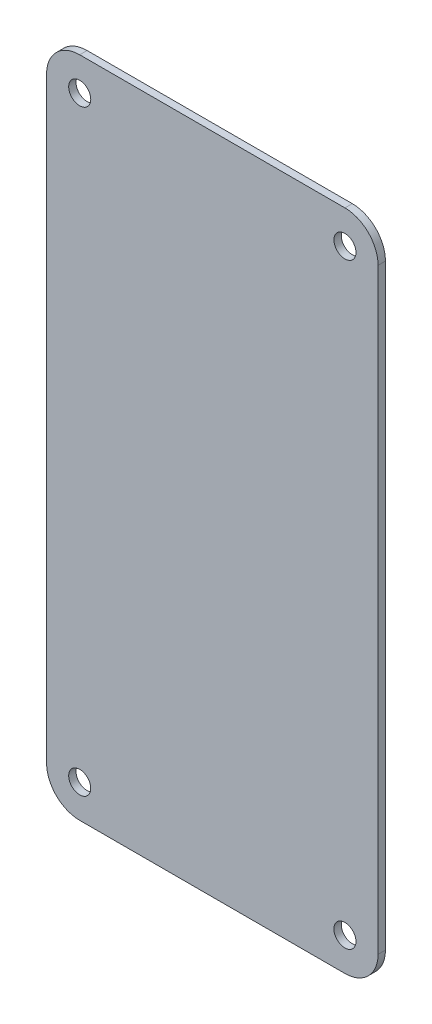
ISO-10303-21;
HEADER;
FILE_DESCRIPTION(('STEP AP214'),'2;1');
FILE_NAME('part.step','',(''),(''),'','','');
FILE_SCHEMA(('AUTOMOTIVE_DESIGN { 1 0 10303 214 1 1 1 1 }'));
ENDSEC;
DATA;
#1=APPLICATION_CONTEXT('core data for automotive mechanical design processes');
#2=APPLICATION_PROTOCOL_DEFINITION('international standard','automotive_design',2000,#1);
#3=PRODUCT_CONTEXT('',#1,'mechanical');
#4=PRODUCT('Part','Part','',(#3));
#5=PRODUCT_RELATED_PRODUCT_CATEGORY('part','',(#4));
#6=PRODUCT_DEFINITION_FORMATION('','',#4);
#7=PRODUCT_DEFINITION_CONTEXT('part definition',#1,'design');
#8=PRODUCT_DEFINITION('design','',#6,#7);
#9=PRODUCT_DEFINITION_SHAPE('','',#8);
#10=(LENGTH_UNIT() NAMED_UNIT(*) SI_UNIT(.MILLI.,.METRE.));
#11=(NAMED_UNIT(*) PLANE_ANGLE_UNIT() SI_UNIT($,.RADIAN.));
#12=(NAMED_UNIT(*) SI_UNIT($,.STERADIAN.) SOLID_ANGLE_UNIT());
#13=UNCERTAINTY_MEASURE_WITH_UNIT(LENGTH_MEASURE(1.E-05),#10,'distance_accuracy_value','');
#14=(GEOMETRIC_REPRESENTATION_CONTEXT(3) GLOBAL_UNCERTAINTY_ASSIGNED_CONTEXT((#13)) GLOBAL_UNIT_ASSIGNED_CONTEXT((#10,
#11,#12)) REPRESENTATION_CONTEXT('',''));
#15=CARTESIAN_POINT('',(0.,0.,0.));
#16=DIRECTION('',(0.,0.,1.));
#17=DIRECTION('',(1.,0.,0.));
#18=AXIS2_PLACEMENT_3D('',#15,#16,#17);
#19=CARTESIAN_POINT('',(-101.443383637,137.056539338,1.));
#20=DIRECTION('',(0.,0.,1.));
#21=DIRECTION('',(1.,0.,0.));
#22=AXIS2_PLACEMENT_3D('',#19,#20,#21);
#23=PLANE('',#22);
#24=CARTESIAN_POINT('',(-101.443383637,56.056539338,1.));
#25=DIRECTION('',(0.,0.,1.));
#26=DIRECTION('',(1.,0.,0.));
#27=AXIS2_PLACEMENT_3D('',#24,#25,#26);
#28=CIRCLE('',#27,1.5);
#29=CARTESIAN_POINT('',(-99.943383637,56.056539338,1.));
#30=VERTEX_POINT('',#29);
#31=EDGE_CURVE('E188',#30,#30,#28,.T.);
#32=ORIENTED_EDGE('',*,*,#31,.F.);
#33=EDGE_LOOP('',(#32));
#34=FACE_BOUND('',#33,.T.);
#35=CARTESIAN_POINT('',(-101.443383637,137.056539338,1.));
#36=DIRECTION('',(0.,0.,1.));
#37=DIRECTION('',(1.,0.,0.));
#38=AXIS2_PLACEMENT_3D('',#35,#36,#37);
#39=CIRCLE('',#38,1.5);
#40=CARTESIAN_POINT('',(-99.943383637,137.056539338,1.));
#41=VERTEX_POINT('',#40);
#42=EDGE_CURVE('E134',#41,#41,#39,.T.);
#43=ORIENTED_EDGE('',*,*,#42,.F.);
#44=EDGE_LOOP('',(#43));
#45=FACE_BOUND('',#44,.T.);
#46=CARTESIAN_POINT('',(-101.443383637,137.056539338,1.));
#47=DIRECTION('',(0.,0.,1.));
#48=DIRECTION('',(1.,0.,0.));
#49=AXIS2_PLACEMENT_3D('',#46,#47,#48);
#50=CIRCLE('',#49,4.5);
#51=CARTESIAN_POINT('',(-101.443383637,141.556539338,1.));
#52=VERTEX_POINT('',#51);
#53=CARTESIAN_POINT('',(-105.943383637,137.056539338,1.));
#54=VERTEX_POINT('',#53);
#55=EDGE_CURVE('E145',#52,#54,#50,.T.);
#56=ORIENTED_EDGE('',*,*,#55,.T.);
#57=DIRECTION('',(0.,-1.,0.));
#58=VECTOR('',#57,1.);
#59=CARTESIAN_POINT('',(-105.943383637,137.056539338,1.));
#60=LINE('',#59,#58);
#61=CARTESIAN_POINT('',(-105.943383637,56.056539338,1.));
#62=VERTEX_POINT('',#61);
#63=EDGE_CURVE('E93',#54,#62,#60,.T.);
#64=ORIENTED_EDGE('',*,*,#63,.T.);
#65=CARTESIAN_POINT('',(-101.443383637,56.056539338,1.));
#66=DIRECTION('',(0.,0.,1.));
#67=DIRECTION('',(1.,0.,0.));
#68=AXIS2_PLACEMENT_3D('',#65,#66,#67);
#69=CIRCLE('',#68,4.5);
#70=CARTESIAN_POINT('',(-101.443383637,51.556539338,1.));
#71=VERTEX_POINT('',#70);
#72=EDGE_CURVE('E160',#62,#71,#69,.T.);
#73=ORIENTED_EDGE('',*,*,#72,.T.);
#74=DIRECTION('',(1.,0.,0.));
#75=VECTOR('',#74,1.);
#76=CARTESIAN_POINT('',(-101.443383637,51.556539338,1.));
#77=LINE('',#76,#75);
#78=CARTESIAN_POINT('',(-65.443383637,51.556539338,1.));
#79=VERTEX_POINT('',#78);
#80=EDGE_CURVE('E173',#71,#79,#77,.T.);
#81=ORIENTED_EDGE('',*,*,#80,.T.);
#82=CARTESIAN_POINT('',(-65.443383637,56.056539338,1.));
#83=DIRECTION('',(0.,0.,1.));
#84=DIRECTION('',(1.,0.,0.));
#85=AXIS2_PLACEMENT_3D('',#82,#83,#84);
#86=CIRCLE('',#85,4.5);
#87=CARTESIAN_POINT('',(-60.943383637,56.056539338,1.));
#88=VERTEX_POINT('',#87);
#89=EDGE_CURVE('E112',#79,#88,#86,.T.);
#90=ORIENTED_EDGE('',*,*,#89,.T.);
#91=DIRECTION('',(0.,1.,0.));
#92=VECTOR('',#91,1.);
#93=CARTESIAN_POINT('',(-60.943383637,56.056539338,1.));
#94=LINE('',#93,#92);
#95=CARTESIAN_POINT('',(-60.943383637,137.056539338,1.));
#96=VERTEX_POINT('',#95);
#97=EDGE_CURVE('E106',#88,#96,#94,.T.);
#98=ORIENTED_EDGE('',*,*,#97,.T.);
#99=CARTESIAN_POINT('',(-65.443383637,137.056539338,1.));
#100=DIRECTION('',(0.,0.,1.));
#101=DIRECTION('',(1.,0.,0.));
#102=AXIS2_PLACEMENT_3D('',#99,#100,#101);
#103=CIRCLE('',#102,4.5);
#104=CARTESIAN_POINT('',(-65.443383637,141.556539338,1.));
#105=VERTEX_POINT('',#104);
#106=EDGE_CURVE('E110',#96,#105,#103,.T.);
#107=ORIENTED_EDGE('',*,*,#106,.T.);
#108=DIRECTION('',(-1.,0.,0.));
#109=VECTOR('',#108,1.);
#110=CARTESIAN_POINT('',(-65.443383637,141.556539338,1.));
#111=LINE('',#110,#109);
#112=EDGE_CURVE('E50',#105,#52,#111,.T.);
#113=ORIENTED_EDGE('',*,*,#112,.T.);
#114=EDGE_LOOP('',(#56,#64,#73,#81,#90,#98,#107,#113));
#115=FACE_BOUND('',#114,.T.);
#116=CARTESIAN_POINT('',(-65.443383637,137.056539338,1.));
#117=DIRECTION('',(0.,0.,1.));
#118=DIRECTION('',(1.,0.,0.));
#119=AXIS2_PLACEMENT_3D('',#116,#117,#118);
#120=CIRCLE('',#119,1.5);
#121=CARTESIAN_POINT('',(-63.943383637,137.056539338,1.));
#122=VERTEX_POINT('',#121);
#123=EDGE_CURVE('E182',#122,#122,#120,.T.);
#124=ORIENTED_EDGE('',*,*,#123,.F.);
#125=EDGE_LOOP('',(#124));
#126=FACE_BOUND('',#125,.T.);
#127=CARTESIAN_POINT('',(-65.443383637,56.056539338,1.));
#128=DIRECTION('',(0.,0.,1.));
#129=DIRECTION('',(1.,0.,0.));
#130=AXIS2_PLACEMENT_3D('',#127,#128,#129);
#131=CIRCLE('',#130,1.5);
#132=CARTESIAN_POINT('',(-63.943383637,56.056539338,1.));
#133=VERTEX_POINT('',#132);
#134=EDGE_CURVE('E194',#133,#133,#131,.T.);
#135=ORIENTED_EDGE('',*,*,#134,.F.);
#136=EDGE_LOOP('',(#135));
#137=FACE_BOUND('',#136,.T.);
#138=ADVANCED_FACE('F33',(#34,#45,#115,#126,#137),#23,.T.);
#139=CARTESIAN_POINT('',(-101.443383637,137.056539338,0.));
#140=DIRECTION('',(0.,0.,1.));
#141=DIRECTION('',(1.,0.,0.));
#142=AXIS2_PLACEMENT_3D('',#139,#140,#141);
#143=PLANE('',#142);
#144=CARTESIAN_POINT('',(-101.443383637,56.056539338,0.));
#145=DIRECTION('',(0.,0.,1.));
#146=DIRECTION('',(1.,0.,0.));
#147=AXIS2_PLACEMENT_3D('',#144,#145,#146);
#148=CIRCLE('',#147,1.5);
#149=CARTESIAN_POINT('',(-99.943383637,56.056539338,0.));
#150=VERTEX_POINT('',#149);
#151=EDGE_CURVE('E191',#150,#150,#148,.T.);
#152=ORIENTED_EDGE('',*,*,#151,.T.);
#153=EDGE_LOOP('',(#152));
#154=FACE_BOUND('',#153,.T.);
#155=CARTESIAN_POINT('',(-101.443383637,137.056539338,0.));
#156=DIRECTION('',(0.,0.,1.));
#157=DIRECTION('',(1.,0.,0.));
#158=AXIS2_PLACEMENT_3D('',#155,#156,#157);
#159=CIRCLE('',#158,1.5);
#160=CARTESIAN_POINT('',(-99.943383637,137.056539338,0.));
#161=VERTEX_POINT('',#160);
#162=EDGE_CURVE('E179',#161,#161,#159,.T.);
#163=ORIENTED_EDGE('',*,*,#162,.T.);
#164=EDGE_LOOP('',(#163));
#165=FACE_BOUND('',#164,.T.);
#166=CARTESIAN_POINT('',(-101.443383637,137.056539338,0.));
#167=DIRECTION('',(0.,0.,1.));
#168=DIRECTION('',(1.,0.,0.));
#169=AXIS2_PLACEMENT_3D('',#166,#167,#168);
#170=CIRCLE('',#169,4.5);
#171=CARTESIAN_POINT('',(-101.443383637,141.556539338,0.));
#172=VERTEX_POINT('',#171);
#173=CARTESIAN_POINT('',(-105.943383637,137.056539338,0.));
#174=VERTEX_POINT('',#173);
#175=EDGE_CURVE('E130',#172,#174,#170,.T.);
#176=ORIENTED_EDGE('',*,*,#175,.F.);
#177=DIRECTION('',(-1.,0.,0.));
#178=VECTOR('',#177,1.);
#179=CARTESIAN_POINT('',(-65.443383637,141.556539338,0.));
#180=LINE('',#179,#178);
#181=CARTESIAN_POINT('',(-65.443383637,141.556539338,0.));
#182=VERTEX_POINT('',#181);
#183=EDGE_CURVE('E85',#182,#172,#180,.T.);
#184=ORIENTED_EDGE('',*,*,#183,.F.);
#185=CARTESIAN_POINT('',(-65.443383637,137.056539338,0.));
#186=DIRECTION('',(0.,0.,1.));
#187=DIRECTION('',(1.,0.,0.));
#188=AXIS2_PLACEMENT_3D('',#185,#186,#187);
#189=CIRCLE('',#188,4.5);
#190=CARTESIAN_POINT('',(-60.943383637,137.056539338,0.));
#191=VERTEX_POINT('',#190);
#192=EDGE_CURVE('E79',#191,#182,#189,.T.);
#193=ORIENTED_EDGE('',*,*,#192,.F.);
#194=DIRECTION('',(0.,1.,0.));
#195=VECTOR('',#194,1.);
#196=CARTESIAN_POINT('',(-60.943383637,56.056539338,0.));
#197=LINE('',#196,#195);
#198=CARTESIAN_POINT('',(-60.943383637,56.056539338,0.));
#199=VERTEX_POINT('',#198);
#200=EDGE_CURVE('E120',#199,#191,#197,.T.);
#201=ORIENTED_EDGE('',*,*,#200,.F.);
#202=CARTESIAN_POINT('',(-65.443383637,56.056539338,0.));
#203=DIRECTION('',(0.,0.,1.));
#204=DIRECTION('',(1.,0.,0.));
#205=AXIS2_PLACEMENT_3D('',#202,#203,#204);
#206=CIRCLE('',#205,4.5);
#207=CARTESIAN_POINT('',(-65.443383637,51.556539338,0.));
#208=VERTEX_POINT('',#207);
#209=EDGE_CURVE('E140',#208,#199,#206,.T.);
#210=ORIENTED_EDGE('',*,*,#209,.F.);
#211=DIRECTION('',(1.,0.,0.));
#212=VECTOR('',#211,1.);
#213=CARTESIAN_POINT('',(-101.443383637,51.556539338,0.));
#214=LINE('',#213,#212);
#215=CARTESIAN_POINT('',(-101.443383637,51.556539338,0.));
#216=VERTEX_POINT('',#215);
#217=EDGE_CURVE('E138',#216,#208,#214,.T.);
#218=ORIENTED_EDGE('',*,*,#217,.F.);
#219=CARTESIAN_POINT('',(-101.443383637,56.056539338,0.));
#220=DIRECTION('',(0.,0.,1.));
#221=DIRECTION('',(1.,0.,0.));
#222=AXIS2_PLACEMENT_3D('',#219,#220,#221);
#223=CIRCLE('',#222,4.5);
#224=CARTESIAN_POINT('',(-105.943383637,56.056539338,0.));
#225=VERTEX_POINT('',#224);
#226=EDGE_CURVE('E136',#225,#216,#223,.T.);
#227=ORIENTED_EDGE('',*,*,#226,.F.);
#228=DIRECTION('',(0.,-1.,0.));
#229=VECTOR('',#228,1.);
#230=CARTESIAN_POINT('',(-105.943383637,137.056539338,0.));
#231=LINE('',#230,#229);
#232=EDGE_CURVE('E133',#174,#225,#231,.T.);
#233=ORIENTED_EDGE('',*,*,#232,.F.);
#234=EDGE_LOOP('',(#176,#184,#193,#201,#210,#218,#227,#233));
#235=FACE_BOUND('',#234,.T.);
#236=CARTESIAN_POINT('',(-65.443383637,137.056539338,0.));
#237=DIRECTION('',(0.,0.,1.));
#238=DIRECTION('',(1.,0.,0.));
#239=AXIS2_PLACEMENT_3D('',#236,#237,#238);
#240=CIRCLE('',#239,1.5);
#241=CARTESIAN_POINT('',(-63.943383637,137.056539338,0.));
#242=VERTEX_POINT('',#241);
#243=EDGE_CURVE('E185',#242,#242,#240,.T.);
#244=ORIENTED_EDGE('',*,*,#243,.T.);
#245=EDGE_LOOP('',(#244));
#246=FACE_BOUND('',#245,.T.);
#247=CARTESIAN_POINT('',(-65.443383637,56.056539338,0.));
#248=DIRECTION('',(0.,0.,1.));
#249=DIRECTION('',(1.,0.,0.));
#250=AXIS2_PLACEMENT_3D('',#247,#248,#249);
#251=CIRCLE('',#250,1.5);
#252=CARTESIAN_POINT('',(-63.943383637,56.056539338,0.));
#253=VERTEX_POINT('',#252);
#254=EDGE_CURVE('E197',#253,#253,#251,.T.);
#255=ORIENTED_EDGE('',*,*,#254,.T.);
#256=EDGE_LOOP('',(#255));
#257=FACE_BOUND('',#256,.T.);
#258=ADVANCED_FACE('F164',(#154,#165,#235,#246,#257),#143,.F.);
#259=CARTESIAN_POINT('',(-101.443383637,137.056539338,1.));
#260=DIRECTION('',(0.,0.,-1.));
#261=DIRECTION('',(-1.,0.,0.));
#262=AXIS2_PLACEMENT_3D('',#259,#260,#261);
#263=CYLINDRICAL_SURFACE('',#262,4.5);
#264=ORIENTED_EDGE('',*,*,#175,.T.);
#265=DIRECTION('',(0.,0.,-1.));
#266=VECTOR('',#265,1.);
#267=CARTESIAN_POINT('',(-105.943383637,137.056539338,1.));
#268=LINE('',#267,#266);
#269=EDGE_CURVE('E11',#54,#174,#268,.T.);
#270=ORIENTED_EDGE('',*,*,#269,.F.);
#271=ORIENTED_EDGE('',*,*,#55,.F.);
#272=DIRECTION('',(0.,0.,-1.));
#273=VECTOR('',#272,1.);
#274=CARTESIAN_POINT('',(-101.443383637,141.556539338,1.));
#275=LINE('',#274,#273);
#276=EDGE_CURVE('E126',#52,#172,#275,.T.);
#277=ORIENTED_EDGE('',*,*,#276,.T.);
#278=EDGE_LOOP('',(#264,#270,#271,#277));
#279=FACE_BOUND('',#278,.T.);
#280=ADVANCED_FACE('F35',(#279),#263,.T.);
#281=CARTESIAN_POINT('',(-105.943383637,137.056539338,1.));
#282=DIRECTION('',(1.,0.,0.));
#283=DIRECTION('',(0.,0.,-1.));
#284=AXIS2_PLACEMENT_3D('',#281,#282,#283);
#285=PLANE('',#284);
#286=ORIENTED_EDGE('',*,*,#232,.T.);
#287=DIRECTION('',(0.,0.,-1.));
#288=VECTOR('',#287,1.);
#289=CARTESIAN_POINT('',(-105.943383637,56.056539338,1.));
#290=LINE('',#289,#288);
#291=EDGE_CURVE('E42',#62,#225,#290,.T.);
#292=ORIENTED_EDGE('',*,*,#291,.F.);
#293=ORIENTED_EDGE('',*,*,#63,.F.);
#294=ORIENTED_EDGE('',*,*,#269,.T.);
#295=EDGE_LOOP('',(#286,#292,#293,#294));
#296=FACE_BOUND('',#295,.T.);
#297=ADVANCED_FACE('F232',(#296),#285,.F.);
#298=CARTESIAN_POINT('',(-101.443383637,56.056539338,1.));
#299=DIRECTION('',(0.,0.,-1.));
#300=DIRECTION('',(-1.,0.,0.));
#301=AXIS2_PLACEMENT_3D('',#298,#299,#300);
#302=CYLINDRICAL_SURFACE('',#301,4.5);
#303=ORIENTED_EDGE('',*,*,#226,.T.);
#304=DIRECTION('',(0.,0.,-1.));
#305=VECTOR('',#304,1.);
#306=CARTESIAN_POINT('',(-101.443383637,51.556539338,1.));
#307=LINE('',#306,#305);
#308=EDGE_CURVE('E152',#71,#216,#307,.T.);
#309=ORIENTED_EDGE('',*,*,#308,.F.);
#310=ORIENTED_EDGE('',*,*,#72,.F.);
#311=ORIENTED_EDGE('',*,*,#291,.T.);
#312=EDGE_LOOP('',(#303,#309,#310,#311));
#313=FACE_BOUND('',#312,.T.);
#314=ADVANCED_FACE('F158',(#313),#302,.T.);
#315=CARTESIAN_POINT('',(-101.443383637,51.556539338,1.));
#316=DIRECTION('',(0.,1.,0.));
#317=DIRECTION('',(0.,0.,1.));
#318=AXIS2_PLACEMENT_3D('',#315,#316,#317);
#319=PLANE('',#318);
#320=ORIENTED_EDGE('',*,*,#217,.T.);
#321=DIRECTION('',(0.,0.,-1.));
#322=VECTOR('',#321,1.);
#323=CARTESIAN_POINT('',(-65.443383637,51.556539338,1.));
#324=LINE('',#323,#322);
#325=EDGE_CURVE('E149',#79,#208,#324,.T.);
#326=ORIENTED_EDGE('',*,*,#325,.F.);
#327=ORIENTED_EDGE('',*,*,#80,.F.);
#328=ORIENTED_EDGE('',*,*,#308,.T.);
#329=EDGE_LOOP('',(#320,#326,#327,#328));
#330=FACE_BOUND('',#329,.T.);
#331=ADVANCED_FACE('F169',(#330),#319,.F.);
#332=CARTESIAN_POINT('',(-65.443383637,56.056539338,1.));
#333=DIRECTION('',(0.,0.,-1.));
#334=DIRECTION('',(-1.,0.,0.));
#335=AXIS2_PLACEMENT_3D('',#332,#333,#334);
#336=CYLINDRICAL_SURFACE('',#335,4.5);
#337=ORIENTED_EDGE('',*,*,#209,.T.);
#338=DIRECTION('',(0.,0.,-1.));
#339=VECTOR('',#338,1.);
#340=CARTESIAN_POINT('',(-60.943383637,56.056539338,1.));
#341=LINE('',#340,#339);
#342=EDGE_CURVE('E121',#88,#199,#341,.T.);
#343=ORIENTED_EDGE('',*,*,#342,.F.);
#344=ORIENTED_EDGE('',*,*,#89,.F.);
#345=ORIENTED_EDGE('',*,*,#325,.T.);
#346=EDGE_LOOP('',(#337,#343,#344,#345));
#347=FACE_BOUND('',#346,.T.);
#348=ADVANCED_FACE('F172',(#347),#336,.T.);
#349=CARTESIAN_POINT('',(-60.943383637,56.056539338,1.));
#350=DIRECTION('',(-1.,0.,0.));
#351=DIRECTION('',(0.,0.,1.));
#352=AXIS2_PLACEMENT_3D('',#349,#350,#351);
#353=PLANE('',#352);
#354=ORIENTED_EDGE('',*,*,#200,.T.);
#355=DIRECTION('',(0.,0.,-1.));
#356=VECTOR('',#355,1.);
#357=CARTESIAN_POINT('',(-60.943383637,137.056539338,1.));
#358=LINE('',#357,#356);
#359=EDGE_CURVE('E117',#96,#191,#358,.T.);
#360=ORIENTED_EDGE('',*,*,#359,.F.);
#361=ORIENTED_EDGE('',*,*,#97,.F.);
#362=ORIENTED_EDGE('',*,*,#342,.T.);
#363=EDGE_LOOP('',(#354,#360,#361,#362));
#364=FACE_BOUND('',#363,.T.);
#365=ADVANCED_FACE('F118',(#364),#353,.F.);
#366=CARTESIAN_POINT('',(-65.443383637,137.056539338,1.));
#367=DIRECTION('',(0.,0.,-1.));
#368=DIRECTION('',(-1.,0.,0.));
#369=AXIS2_PLACEMENT_3D('',#366,#367,#368);
#370=CYLINDRICAL_SURFACE('',#369,4.5);
#371=ORIENTED_EDGE('',*,*,#192,.T.);
#372=DIRECTION('',(0.,0.,-1.));
#373=VECTOR('',#372,1.);
#374=CARTESIAN_POINT('',(-65.443383637,141.556539338,1.));
#375=LINE('',#374,#373);
#376=EDGE_CURVE('E122',#105,#182,#375,.T.);
#377=ORIENTED_EDGE('',*,*,#376,.F.);
#378=ORIENTED_EDGE('',*,*,#106,.F.);
#379=ORIENTED_EDGE('',*,*,#359,.T.);
#380=EDGE_LOOP('',(#371,#377,#378,#379));
#381=FACE_BOUND('',#380,.T.);
#382=ADVANCED_FACE('F124',(#381),#370,.T.);
#383=CARTESIAN_POINT('',(-65.443383637,141.556539338,1.));
#384=DIRECTION('',(0.,-1.,0.));
#385=DIRECTION('',(0.,0.,-1.));
#386=AXIS2_PLACEMENT_3D('',#383,#384,#385);
#387=PLANE('',#386);
#388=ORIENTED_EDGE('',*,*,#183,.T.);
#389=ORIENTED_EDGE('',*,*,#276,.F.);
#390=ORIENTED_EDGE('',*,*,#112,.F.);
#391=ORIENTED_EDGE('',*,*,#376,.T.);
#392=EDGE_LOOP('',(#388,#389,#390,#391));
#393=FACE_BOUND('',#392,.T.);
#394=ADVANCED_FACE('F220',(#393),#387,.F.);
#395=CARTESIAN_POINT('',(-101.443383637,137.056539338,1.));
#396=DIRECTION('',(0.,0.,-1.));
#397=DIRECTION('',(-1.,0.,0.));
#398=AXIS2_PLACEMENT_3D('',#395,#396,#397);
#399=CYLINDRICAL_SURFACE('',#398,1.5);
#400=ORIENTED_EDGE('',*,*,#42,.T.);
#401=EDGE_LOOP('',(#400));
#402=FACE_BOUND('',#401,.T.);
#403=ORIENTED_EDGE('',*,*,#162,.F.);
#404=EDGE_LOOP('',(#403));
#405=FACE_BOUND('',#404,.T.);
#406=ADVANCED_FACE('F217',(#402,#405),#399,.F.);
#407=CARTESIAN_POINT('',(-65.443383637,137.056539338,1.));
#408=DIRECTION('',(0.,0.,-1.));
#409=DIRECTION('',(-1.,0.,0.));
#410=AXIS2_PLACEMENT_3D('',#407,#408,#409);
#411=CYLINDRICAL_SURFACE('',#410,1.5);
#412=ORIENTED_EDGE('',*,*,#123,.T.);
#413=EDGE_LOOP('',(#412));
#414=FACE_BOUND('',#413,.T.);
#415=ORIENTED_EDGE('',*,*,#243,.F.);
#416=EDGE_LOOP('',(#415));
#417=FACE_BOUND('',#416,.T.);
#418=ADVANCED_FACE('F296',(#414,#417),#411,.F.);
#419=CARTESIAN_POINT('',(-101.443383637,56.056539338,1.));
#420=DIRECTION('',(0.,0.,-1.));
#421=DIRECTION('',(-1.,0.,0.));
#422=AXIS2_PLACEMENT_3D('',#419,#420,#421);
#423=CYLINDRICAL_SURFACE('',#422,1.5);
#424=ORIENTED_EDGE('',*,*,#31,.T.);
#425=EDGE_LOOP('',(#424));
#426=FACE_BOUND('',#425,.T.);
#427=ORIENTED_EDGE('',*,*,#151,.F.);
#428=EDGE_LOOP('',(#427));
#429=FACE_BOUND('',#428,.T.);
#430=ADVANCED_FACE('F304',(#426,#429),#423,.F.);
#431=CARTESIAN_POINT('',(-65.443383637,56.056539338,1.));
#432=DIRECTION('',(0.,0.,-1.));
#433=DIRECTION('',(-1.,0.,0.));
#434=AXIS2_PLACEMENT_3D('',#431,#432,#433);
#435=CYLINDRICAL_SURFACE('',#434,1.5);
#436=ORIENTED_EDGE('',*,*,#134,.T.);
#437=EDGE_LOOP('',(#436));
#438=FACE_BOUND('',#437,.T.);
#439=ORIENTED_EDGE('',*,*,#254,.F.);
#440=EDGE_LOOP('',(#439));
#441=FACE_BOUND('',#440,.T.);
#442=ADVANCED_FACE('F203',(#438,#441),#435,.F.);
#443=CLOSED_SHELL('',(#138,#258,#280,#297,#314,#331,#348,#365,#382,#394,#406,#418,#430,#442));
#444=MANIFOLD_SOLID_BREP('B2',#443);
#445=ADVANCED_BREP_SHAPE_REPRESENTATION('',(#18,#444),#14);
#446=SHAPE_DEFINITION_REPRESENTATION(#9,#445);
ENDSEC;
END-ISO-10303-21;
